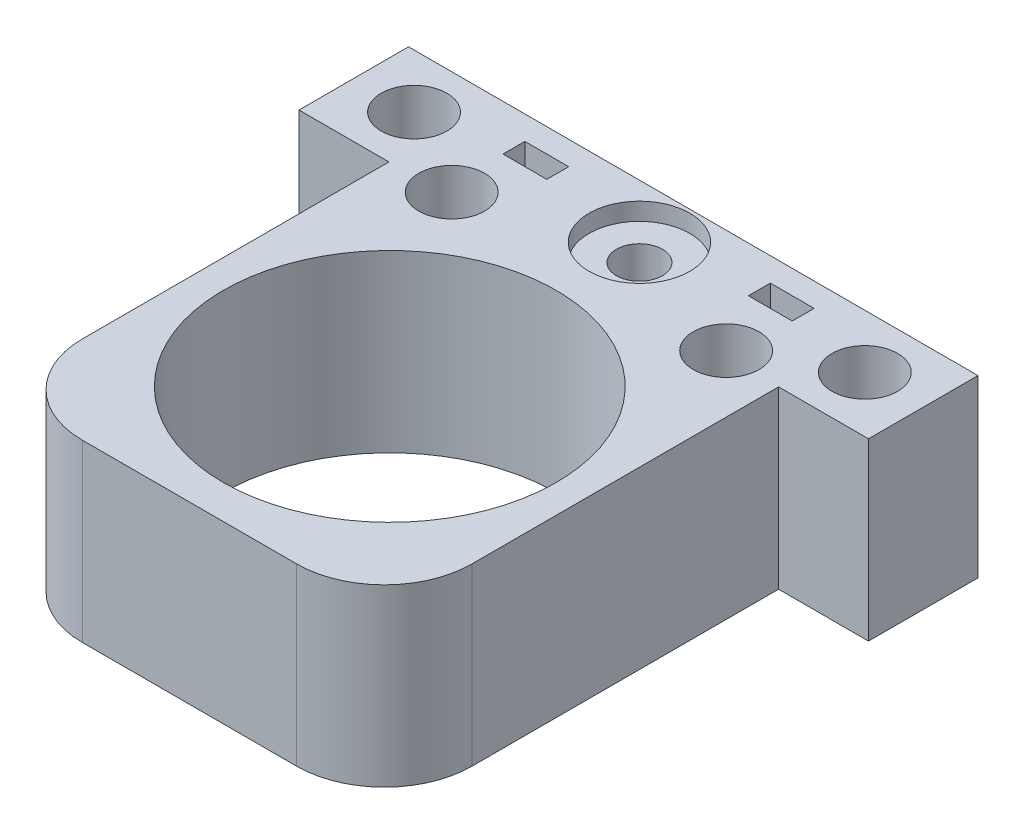
ISO-10303-21;
HEADER;
FILE_DESCRIPTION(('STEP AP214'),'2;1');
FILE_NAME('part.step','',(''),(''),'','','');
FILE_SCHEMA(('AUTOMOTIVE_DESIGN { 1 0 10303 214 1 1 1 1 }'));
ENDSEC;
DATA;
#1=APPLICATION_CONTEXT('core data for automotive mechanical design processes');
#2=APPLICATION_PROTOCOL_DEFINITION('international standard','automotive_design',2000,#1);
#3=PRODUCT_CONTEXT('',#1,'mechanical');
#4=PRODUCT('Part','Part','',(#3));
#5=PRODUCT_RELATED_PRODUCT_CATEGORY('part','',(#4));
#6=PRODUCT_DEFINITION_FORMATION('','',#4);
#7=PRODUCT_DEFINITION_CONTEXT('part definition',#1,'design');
#8=PRODUCT_DEFINITION('design','',#6,#7);
#9=PRODUCT_DEFINITION_SHAPE('','',#8);
#10=(LENGTH_UNIT() NAMED_UNIT(*) SI_UNIT(.MILLI.,.METRE.));
#11=(NAMED_UNIT(*) PLANE_ANGLE_UNIT() SI_UNIT($,.RADIAN.));
#12=(NAMED_UNIT(*) SI_UNIT($,.STERADIAN.) SOLID_ANGLE_UNIT());
#13=UNCERTAINTY_MEASURE_WITH_UNIT(LENGTH_MEASURE(1.E-05),#10,'distance_accuracy_value','');
#14=(GEOMETRIC_REPRESENTATION_CONTEXT(3) GLOBAL_UNCERTAINTY_ASSIGNED_CONTEXT((#13)) GLOBAL_UNIT_ASSIGNED_CONTEXT((#10,
#11,#12)) REPRESENTATION_CONTEXT('',''));
#15=CARTESIAN_POINT('',(0.,0.,0.));
#16=DIRECTION('',(0.,0.,1.));
#17=DIRECTION('',(1.,0.,0.));
#18=AXIS2_PLACEMENT_3D('',#15,#16,#17);
#19=CARTESIAN_POINT('',(0.,0.,-12.7142223868873));
#20=DIRECTION('',(0.,1.,0.));
#21=DIRECTION('',(0.,0.,1.));
#22=AXIS2_PLACEMENT_3D('',#19,#20,#21);
#23=CYLINDRICAL_SURFACE('',#22,5.25);
#24=CARTESIAN_POINT('',(0.,56.,-12.7142223868873));
#25=DIRECTION('',(0.,1.,0.));
#26=DIRECTION('',(0.,0.,1.));
#27=AXIS2_PLACEMENT_3D('',#24,#25,#26);
#28=CIRCLE('',#27,5.25);
#29=CARTESIAN_POINT('',(0.,56.,-7.46422238688734));
#30=VERTEX_POINT('',#29);
#31=EDGE_CURVE('E315',#30,#30,#28,.F.);
#32=ORIENTED_EDGE('',*,*,#31,.F.);
#33=EDGE_LOOP('',(#32));
#34=FACE_BOUND('',#33,.T.);
#35=CARTESIAN_POINT('',(0.,20.,-12.7142223868873));
#36=DIRECTION('',(0.,-1.,0.));
#37=DIRECTION('',(0.,0.,-1.));
#38=AXIS2_PLACEMENT_3D('',#35,#36,#37);
#39=CIRCLE('',#38,5.25);
#40=CARTESIAN_POINT('',(0.,20.,-17.9642223868873));
#41=VERTEX_POINT('',#40);
#42=EDGE_CURVE('E242',#41,#41,#39,.F.);
#43=ORIENTED_EDGE('',*,*,#42,.F.);
#44=EDGE_LOOP('',(#43));
#45=FACE_BOUND('',#44,.T.);
#46=ADVANCED_FACE('F39',(#34,#45),#23,.F.);
#47=CARTESIAN_POINT('',(65.,60.,-25.));
#48=DIRECTION('',(-1.,0.,0.));
#49=DIRECTION('',(0.,0.,1.));
#50=AXIS2_PLACEMENT_3D('',#47,#48,#49);
#51=PLANE('',#50);
#52=DIRECTION('',(0.,0.,-1.));
#53=VECTOR('',#52,1.);
#54=CARTESIAN_POINT('',(65.,60.,-25.));
#55=LINE('',#54,#53);
#56=CARTESIAN_POINT('',(65.,60.,0.));
#57=VERTEX_POINT('',#56);
#58=CARTESIAN_POINT('',(65.,60.,-25.));
#59=VERTEX_POINT('',#58);
#60=EDGE_CURVE('E323',#57,#59,#55,.T.);
#61=ORIENTED_EDGE('',*,*,#60,.F.);
#62=DIRECTION('',(0.,1.,0.));
#63=VECTOR('',#62,1.);
#64=CARTESIAN_POINT('',(65.,20.,0.));
#65=LINE('',#64,#63);
#66=CARTESIAN_POINT('',(65.,20.,0.));
#67=VERTEX_POINT('',#66);
#68=EDGE_CURVE('E200',#67,#57,#65,.T.);
#69=ORIENTED_EDGE('',*,*,#68,.F.);
#70=DIRECTION('',(0.,0.,1.));
#71=VECTOR('',#70,1.);
#72=CARTESIAN_POINT('',(65.,20.,90.));
#73=LINE('',#72,#71);
#74=CARTESIAN_POINT('',(65.,20.,-25.));
#75=VERTEX_POINT('',#74);
#76=EDGE_CURVE('E197',#75,#67,#73,.T.);
#77=ORIENTED_EDGE('',*,*,#76,.F.);
#78=DIRECTION('',(0.,-1.,0.));
#79=VECTOR('',#78,1.);
#80=CARTESIAN_POINT('',(65.,60.,-25.));
#81=LINE('',#80,#79);
#82=EDGE_CURVE('E338',#59,#75,#81,.T.);
#83=ORIENTED_EDGE('',*,*,#82,.F.);
#84=EDGE_LOOP('',(#61,#69,#77,#83));
#85=FACE_BOUND('',#84,.T.);
#86=ADVANCED_FACE('F453',(#85),#51,.F.);
#87=CARTESIAN_POINT('',(-65.,60.,-25.));
#88=DIRECTION('',(0.,0.,1.));
#89=DIRECTION('',(1.,0.,0.));
#90=AXIS2_PLACEMENT_3D('',#87,#88,#89);
#91=PLANE('',#90);
#92=DIRECTION('',(1.,0.,0.));
#93=VECTOR('',#92,1.);
#94=CARTESIAN_POINT('',(-65.,20.,-25.));
#95=LINE('',#94,#93);
#96=CARTESIAN_POINT('',(-65.,20.,-25.));
#97=VERTEX_POINT('',#96);
#98=EDGE_CURVE('E194',#97,#75,#95,.T.);
#99=ORIENTED_EDGE('',*,*,#98,.F.);
#100=DIRECTION('',(0.,-1.,0.));
#101=VECTOR('',#100,1.);
#102=CARTESIAN_POINT('',(-65.,60.,-25.));
#103=LINE('',#102,#101);
#104=CARTESIAN_POINT('',(-65.,60.,-25.));
#105=VERTEX_POINT('',#104);
#106=EDGE_CURVE('E192',#105,#97,#103,.T.);
#107=ORIENTED_EDGE('',*,*,#106,.F.);
#108=DIRECTION('',(-1.,0.,0.));
#109=VECTOR('',#108,1.);
#110=CARTESIAN_POINT('',(-65.,60.,-25.));
#111=LINE('',#110,#109);
#112=EDGE_CURVE('E330',#59,#105,#111,.T.);
#113=ORIENTED_EDGE('',*,*,#112,.F.);
#114=ORIENTED_EDGE('',*,*,#82,.T.);
#115=EDGE_LOOP('',(#99,#107,#113,#114));
#116=FACE_BOUND('',#115,.T.);
#117=ADVANCED_FACE('F461',(#116),#91,.F.);
#118=CARTESIAN_POINT('',(-65.,60.,-25.));
#119=DIRECTION('',(1.,0.,0.));
#120=DIRECTION('',(0.,0.,-1.));
#121=AXIS2_PLACEMENT_3D('',#118,#119,#120);
#122=PLANE('',#121);
#123=DIRECTION('',(0.,0.,-1.));
#124=VECTOR('',#123,1.);
#125=CARTESIAN_POINT('',(-65.,20.,90.));
#126=LINE('',#125,#124);
#127=CARTESIAN_POINT('',(-65.,20.,0.));
#128=VERTEX_POINT('',#127);
#129=EDGE_CURVE('E180',#128,#97,#126,.T.);
#130=ORIENTED_EDGE('',*,*,#129,.F.);
#131=DIRECTION('',(0.,1.,0.));
#132=VECTOR('',#131,1.);
#133=CARTESIAN_POINT('',(-65.,20.,0.));
#134=LINE('',#133,#132);
#135=CARTESIAN_POINT('',(-65.,60.,0.));
#136=VERTEX_POINT('',#135);
#137=EDGE_CURVE('E167',#128,#136,#134,.T.);
#138=ORIENTED_EDGE('',*,*,#137,.T.);
#139=DIRECTION('',(0.,0.,1.));
#140=VECTOR('',#139,1.);
#141=CARTESIAN_POINT('',(-65.,60.,-25.));
#142=LINE('',#141,#140);
#143=EDGE_CURVE('E333',#105,#136,#142,.T.);
#144=ORIENTED_EDGE('',*,*,#143,.F.);
#145=ORIENTED_EDGE('',*,*,#106,.T.);
#146=EDGE_LOOP('',(#130,#138,#144,#145));
#147=FACE_BOUND('',#146,.T.);
#148=ADVANCED_FACE('F190',(#147),#122,.F.);
#149=CARTESIAN_POINT('',(51.4526055476511,0.,-12.7142223868873));
#150=DIRECTION('',(0.,1.,0.));
#151=DIRECTION('',(0.,0.,1.));
#152=AXIS2_PLACEMENT_3D('',#149,#150,#151);
#153=CYLINDRICAL_SURFACE('',#152,7.5);
#154=CARTESIAN_POINT('',(51.4526055476511,60.,-12.7142223868873));
#155=DIRECTION('',(0.,1.,0.));
#156=DIRECTION('',(0.,0.,-1.));
#157=AXIS2_PLACEMENT_3D('',#154,#155,#156);
#158=CIRCLE('',#157,7.5);
#159=CARTESIAN_POINT('',(51.4526055476511,60.,-20.2142223868873));
#160=VERTEX_POINT('',#159);
#161=EDGE_CURVE('E324',#160,#160,#158,.T.);
#162=ORIENTED_EDGE('',*,*,#161,.T.);
#163=EDGE_LOOP('',(#162));
#164=FACE_BOUND('',#163,.T.);
#165=CARTESIAN_POINT('',(51.4526055476511,20.,-12.7142223868873));
#166=DIRECTION('',(0.,-1.,0.));
#167=DIRECTION('',(0.,0.,-1.));
#168=AXIS2_PLACEMENT_3D('',#165,#166,#167);
#169=CIRCLE('',#168,7.5);
#170=CARTESIAN_POINT('',(51.4526055476511,20.,-20.2142223868873));
#171=VERTEX_POINT('',#170);
#172=EDGE_CURVE('E238',#171,#171,#169,.F.);
#173=ORIENTED_EDGE('',*,*,#172,.F.);
#174=EDGE_LOOP('',(#173));
#175=FACE_BOUND('',#174,.T.);
#176=ADVANCED_FACE('F474',(#164,#175),#153,.F.);
#177=CARTESIAN_POINT('',(-51.4526055476511,0.,-12.7142223868873));
#178=DIRECTION('',(0.,1.,0.));
#179=DIRECTION('',(0.,0.,1.));
#180=AXIS2_PLACEMENT_3D('',#177,#178,#179);
#181=CYLINDRICAL_SURFACE('',#180,7.5);
#182=CARTESIAN_POINT('',(-51.4526055476511,60.,-12.7142223868873));
#183=DIRECTION('',(0.,1.,0.));
#184=DIRECTION('',(0.,0.,1.));
#185=AXIS2_PLACEMENT_3D('',#182,#183,#184);
#186=CIRCLE('',#185,7.5);
#187=CARTESIAN_POINT('',(-51.4526055476511,60.,-5.21422238688734));
#188=VERTEX_POINT('',#187);
#189=EDGE_CURVE('E319',#188,#188,#186,.T.);
#190=ORIENTED_EDGE('',*,*,#189,.T.);
#191=EDGE_LOOP('',(#190));
#192=FACE_BOUND('',#191,.T.);
#193=CARTESIAN_POINT('',(-51.4526055476511,20.,-12.7142223868873));
#194=DIRECTION('',(0.,-1.,0.));
#195=DIRECTION('',(0.,0.,-1.));
#196=AXIS2_PLACEMENT_3D('',#193,#194,#195);
#197=CIRCLE('',#196,7.5);
#198=CARTESIAN_POINT('',(-51.4526055476511,20.,-20.2142223868873));
#199=VERTEX_POINT('',#198);
#200=EDGE_CURVE('E234',#199,#199,#197,.F.);
#201=ORIENTED_EDGE('',*,*,#200,.F.);
#202=EDGE_LOOP('',(#201));
#203=FACE_BOUND('',#202,.T.);
#204=ADVANCED_FACE('F470',(#192,#203),#181,.F.);
#205=CARTESIAN_POINT('',(-33.01308524261,0.,-19.5794065637342));
#206=DIRECTION('',(-1.,0.,0.));
#207=DIRECTION('',(0.,0.,1.));
#208=AXIS2_PLACEMENT_3D('',#205,#206,#207);
#209=PLANE('',#208);
#210=DIRECTION('',(0.,0.,1.));
#211=VECTOR('',#210,1.);
#212=CARTESIAN_POINT('',(-33.01308524261,20.,-19.5794065637342));
#213=LINE('',#212,#211);
#214=CARTESIAN_POINT('',(-33.01308524261,20.,-19.5794065637342));
#215=VERTEX_POINT('',#214);
#216=CARTESIAN_POINT('',(-33.01308524261,20.,-14.5794065637342));
#217=VERTEX_POINT('',#216);
#218=EDGE_CURVE('E231',#215,#217,#213,.T.);
#219=ORIENTED_EDGE('',*,*,#218,.F.);
#220=DIRECTION('',(0.,1.,0.));
#221=VECTOR('',#220,1.);
#222=CARTESIAN_POINT('',(-33.01308524261,0.,-19.5794065637342));
#223=LINE('',#222,#221);
#224=CARTESIAN_POINT('',(-33.01308524261,60.,-19.5794065637342));
#225=VERTEX_POINT('',#224);
#226=EDGE_CURVE('E299',#215,#225,#223,.T.);
#227=ORIENTED_EDGE('',*,*,#226,.T.);
#228=DIRECTION('',(0.,0.,1.));
#229=VECTOR('',#228,1.);
#230=CARTESIAN_POINT('',(-33.01308524261,60.,-19.5794065637342));
#231=LINE('',#230,#229);
#232=CARTESIAN_POINT('',(-33.01308524261,60.,-14.5794065637342));
#233=VERTEX_POINT('',#232);
#234=EDGE_CURVE('E274',#225,#233,#231,.T.);
#235=ORIENTED_EDGE('',*,*,#234,.T.);
#236=DIRECTION('',(0.,1.,0.));
#237=VECTOR('',#236,1.);
#238=CARTESIAN_POINT('',(-33.01308524261,0.,-14.5794065637342));
#239=LINE('',#238,#237);
#240=EDGE_CURVE('E298',#217,#233,#239,.T.);
#241=ORIENTED_EDGE('',*,*,#240,.F.);
#242=EDGE_LOOP('',(#219,#227,#235,#241));
#243=FACE_BOUND('',#242,.T.);
#244=ADVANCED_FACE('F473',(#243),#209,.F.);
#245=CARTESIAN_POINT('',(-33.01308524261,0.,-19.5794065637342));
#246=DIRECTION('',(0.,0.,-1.));
#247=DIRECTION('',(-1.,0.,0.));
#248=AXIS2_PLACEMENT_3D('',#245,#246,#247);
#249=PLANE('',#248);
#250=DIRECTION('',(-1.,0.,0.));
#251=VECTOR('',#250,1.);
#252=CARTESIAN_POINT('',(-33.01308524261,20.,-19.5794065637342));
#253=LINE('',#252,#251);
#254=CARTESIAN_POINT('',(-23.01308524261,20.,-19.5794065637342));
#255=VERTEX_POINT('',#254);
#256=EDGE_CURVE('E228',#255,#215,#253,.T.);
#257=ORIENTED_EDGE('',*,*,#256,.F.);
#258=DIRECTION('',(0.,1.,0.));
#259=VECTOR('',#258,1.);
#260=CARTESIAN_POINT('',(-23.01308524261,0.,-19.5794065637342));
#261=LINE('',#260,#259);
#262=CARTESIAN_POINT('',(-23.01308524261,60.,-19.5794065637342));
#263=VERTEX_POINT('',#262);
#264=EDGE_CURVE('E303',#255,#263,#261,.T.);
#265=ORIENTED_EDGE('',*,*,#264,.T.);
#266=DIRECTION('',(-1.,0.,0.));
#267=VECTOR('',#266,1.);
#268=CARTESIAN_POINT('',(-33.01308524261,60.,-19.5794065637342));
#269=LINE('',#268,#267);
#270=EDGE_CURVE('E294',#263,#225,#269,.T.);
#271=ORIENTED_EDGE('',*,*,#270,.T.);
#272=ORIENTED_EDGE('',*,*,#226,.F.);
#273=EDGE_LOOP('',(#257,#265,#271,#272));
#274=FACE_BOUND('',#273,.T.);
#275=ADVANCED_FACE('F522',(#274),#249,.F.);
#276=CARTESIAN_POINT('',(-23.01308524261,0.,-19.5794065637342));
#277=DIRECTION('',(1.,0.,0.));
#278=DIRECTION('',(0.,0.,-1.));
#279=AXIS2_PLACEMENT_3D('',#276,#277,#278);
#280=PLANE('',#279);
#281=DIRECTION('',(0.,0.,-1.));
#282=VECTOR('',#281,1.);
#283=CARTESIAN_POINT('',(-23.01308524261,20.,-19.5794065637342));
#284=LINE('',#283,#282);
#285=CARTESIAN_POINT('',(-23.01308524261,20.,-14.5794065637342));
#286=VERTEX_POINT('',#285);
#287=EDGE_CURVE('E225',#286,#255,#284,.T.);
#288=ORIENTED_EDGE('',*,*,#287,.F.);
#289=DIRECTION('',(0.,1.,0.));
#290=VECTOR('',#289,1.);
#291=CARTESIAN_POINT('',(-23.01308524261,0.,-14.5794065637342));
#292=LINE('',#291,#290);
#293=CARTESIAN_POINT('',(-23.01308524261,60.,-14.5794065637342));
#294=VERTEX_POINT('',#293);
#295=EDGE_CURVE('E306',#286,#294,#292,.T.);
#296=ORIENTED_EDGE('',*,*,#295,.T.);
#297=DIRECTION('',(0.,0.,-1.));
#298=VECTOR('',#297,1.);
#299=CARTESIAN_POINT('',(-23.01308524261,60.,-19.5794065637342));
#300=LINE('',#299,#298);
#301=EDGE_CURVE('E290',#294,#263,#300,.T.);
#302=ORIENTED_EDGE('',*,*,#301,.T.);
#303=ORIENTED_EDGE('',*,*,#264,.F.);
#304=EDGE_LOOP('',(#288,#296,#302,#303));
#305=FACE_BOUND('',#304,.T.);
#306=ADVANCED_FACE('F525',(#305),#280,.F.);
#307=CARTESIAN_POINT('',(-33.01308524261,0.,-14.5794065637342));
#308=DIRECTION('',(0.,0.,1.));
#309=DIRECTION('',(1.,0.,0.));
#310=AXIS2_PLACEMENT_3D('',#307,#308,#309);
#311=PLANE('',#310);
#312=DIRECTION('',(1.,0.,0.));
#313=VECTOR('',#312,1.);
#314=CARTESIAN_POINT('',(-33.01308524261,20.,-14.5794065637342));
#315=LINE('',#314,#313);
#316=EDGE_CURVE('E222',#217,#286,#315,.T.);
#317=ORIENTED_EDGE('',*,*,#316,.F.);
#318=ORIENTED_EDGE('',*,*,#240,.T.);
#319=DIRECTION('',(1.,0.,0.));
#320=VECTOR('',#319,1.);
#321=CARTESIAN_POINT('',(-33.01308524261,60.,-14.5794065637342));
#322=LINE('',#321,#320);
#323=EDGE_CURVE('E286',#233,#294,#322,.T.);
#324=ORIENTED_EDGE('',*,*,#323,.T.);
#325=ORIENTED_EDGE('',*,*,#295,.F.);
#326=EDGE_LOOP('',(#317,#318,#324,#325));
#327=FACE_BOUND('',#326,.T.);
#328=ADVANCED_FACE('F520',(#327),#311,.F.);
#329=CARTESIAN_POINT('',(33.01308524261,0.,-19.5794065637342));
#330=DIRECTION('',(0.,0.,-1.));
#331=DIRECTION('',(-1.,0.,0.));
#332=AXIS2_PLACEMENT_3D('',#329,#330,#331);
#333=PLANE('',#332);
#334=DIRECTION('',(-1.,0.,0.));
#335=VECTOR('',#334,1.);
#336=CARTESIAN_POINT('',(33.01308524261,20.,-19.5794065637342));
#337=LINE('',#336,#335);
#338=CARTESIAN_POINT('',(33.01308524261,20.,-19.5794065637342));
#339=VERTEX_POINT('',#338);
#340=CARTESIAN_POINT('',(23.01308524261,20.,-19.5794065637342));
#341=VERTEX_POINT('',#340);
#342=EDGE_CURVE('E219',#339,#341,#337,.T.);
#343=ORIENTED_EDGE('',*,*,#342,.F.);
#344=DIRECTION('',(0.,1.,0.));
#345=VECTOR('',#344,1.);
#346=CARTESIAN_POINT('',(33.01308524261,0.,-19.5794065637342));
#347=LINE('',#346,#345);
#348=CARTESIAN_POINT('',(33.01308524261,60.,-19.5794065637342));
#349=VERTEX_POINT('',#348);
#350=EDGE_CURVE('E271',#339,#349,#347,.T.);
#351=ORIENTED_EDGE('',*,*,#350,.T.);
#352=DIRECTION('',(-1.,0.,0.));
#353=VECTOR('',#352,1.);
#354=CARTESIAN_POINT('',(33.01308524261,60.,-19.5794065637342));
#355=LINE('',#354,#353);
#356=CARTESIAN_POINT('',(23.01308524261,60.,-19.5794065637342));
#357=VERTEX_POINT('',#356);
#358=EDGE_CURVE('E254',#349,#357,#355,.T.);
#359=ORIENTED_EDGE('',*,*,#358,.T.);
#360=DIRECTION('',(0.,1.,0.));
#361=VECTOR('',#360,1.);
#362=CARTESIAN_POINT('',(23.01308524261,0.,-19.5794065637342));
#363=LINE('',#362,#361);
#364=EDGE_CURVE('E270',#341,#357,#363,.T.);
#365=ORIENTED_EDGE('',*,*,#364,.F.);
#366=EDGE_LOOP('',(#343,#351,#359,#365));
#367=FACE_BOUND('',#366,.T.);
#368=ADVANCED_FACE('F510',(#367),#333,.F.);
#369=CARTESIAN_POINT('',(33.01308524261,0.,-19.5794065637342));
#370=DIRECTION('',(1.,0.,0.));
#371=DIRECTION('',(0.,0.,-1.));
#372=AXIS2_PLACEMENT_3D('',#369,#370,#371);
#373=PLANE('',#372);
#374=DIRECTION('',(0.,0.,-1.));
#375=VECTOR('',#374,1.);
#376=CARTESIAN_POINT('',(33.01308524261,20.,-19.5794065637342));
#377=LINE('',#376,#375);
#378=CARTESIAN_POINT('',(33.01308524261,20.,-14.5794065637342));
#379=VERTEX_POINT('',#378);
#380=EDGE_CURVE('E216',#379,#339,#377,.T.);
#381=ORIENTED_EDGE('',*,*,#380,.F.);
#382=DIRECTION('',(0.,1.,0.));
#383=VECTOR('',#382,1.);
#384=CARTESIAN_POINT('',(33.01308524261,0.,-14.5794065637342));
#385=LINE('',#384,#383);
#386=CARTESIAN_POINT('',(33.01308524261,60.,-14.5794065637342));
#387=VERTEX_POINT('',#386);
#388=EDGE_CURVE('E275',#379,#387,#385,.T.);
#389=ORIENTED_EDGE('',*,*,#388,.T.);
#390=DIRECTION('',(0.,0.,-1.));
#391=VECTOR('',#390,1.);
#392=CARTESIAN_POINT('',(33.01308524261,60.,-19.5794065637342));
#393=LINE('',#392,#391);
#394=EDGE_CURVE('E266',#387,#349,#393,.T.);
#395=ORIENTED_EDGE('',*,*,#394,.T.);
#396=ORIENTED_EDGE('',*,*,#350,.F.);
#397=EDGE_LOOP('',(#381,#389,#395,#396));
#398=FACE_BOUND('',#397,.T.);
#399=ADVANCED_FACE('F506',(#398),#373,.F.);
#400=CARTESIAN_POINT('',(33.01308524261,0.,-14.5794065637342));
#401=DIRECTION('',(0.,0.,1.));
#402=DIRECTION('',(1.,0.,0.));
#403=AXIS2_PLACEMENT_3D('',#400,#401,#402);
#404=PLANE('',#403);
#405=DIRECTION('',(1.,0.,0.));
#406=VECTOR('',#405,1.);
#407=CARTESIAN_POINT('',(33.01308524261,20.,-14.5794065637342));
#408=LINE('',#407,#406);
#409=CARTESIAN_POINT('',(23.01308524261,20.,-14.5794065637342));
#410=VERTEX_POINT('',#409);
#411=EDGE_CURVE('E213',#410,#379,#408,.T.);
#412=ORIENTED_EDGE('',*,*,#411,.F.);
#413=DIRECTION('',(0.,1.,0.));
#414=VECTOR('',#413,1.);
#415=CARTESIAN_POINT('',(23.01308524261,0.,-14.5794065637342));
#416=LINE('',#415,#414);
#417=CARTESIAN_POINT('',(23.01308524261,60.,-14.5794065637342));
#418=VERTEX_POINT('',#417);
#419=EDGE_CURVE('E278',#410,#418,#416,.T.);
#420=ORIENTED_EDGE('',*,*,#419,.T.);
#421=DIRECTION('',(1.,0.,0.));
#422=VECTOR('',#421,1.);
#423=CARTESIAN_POINT('',(33.01308524261,60.,-14.5794065637342));
#424=LINE('',#423,#422);
#425=EDGE_CURVE('E262',#418,#387,#424,.T.);
#426=ORIENTED_EDGE('',*,*,#425,.T.);
#427=ORIENTED_EDGE('',*,*,#388,.F.);
#428=EDGE_LOOP('',(#412,#420,#426,#427));
#429=FACE_BOUND('',#428,.T.);
#430=ADVANCED_FACE('F509',(#429),#404,.F.);
#431=CARTESIAN_POINT('',(23.01308524261,0.,-19.5794065637342));
#432=DIRECTION('',(-1.,0.,0.));
#433=DIRECTION('',(0.,0.,1.));
#434=AXIS2_PLACEMENT_3D('',#431,#432,#433);
#435=PLANE('',#434);
#436=DIRECTION('',(0.,0.,1.));
#437=VECTOR('',#436,1.);
#438=CARTESIAN_POINT('',(23.01308524261,20.,-19.5794065637342));
#439=LINE('',#438,#437);
#440=EDGE_CURVE('E210',#341,#410,#439,.T.);
#441=ORIENTED_EDGE('',*,*,#440,.F.);
#442=ORIENTED_EDGE('',*,*,#364,.T.);
#443=DIRECTION('',(0.,0.,1.));
#444=VECTOR('',#443,1.);
#445=CARTESIAN_POINT('',(23.01308524261,60.,-19.5794065637342));
#446=LINE('',#445,#444);
#447=EDGE_CURVE('E258',#357,#418,#446,.T.);
#448=ORIENTED_EDGE('',*,*,#447,.T.);
#449=ORIENTED_EDGE('',*,*,#419,.F.);
#450=EDGE_LOOP('',(#441,#442,#448,#449));
#451=FACE_BOUND('',#450,.T.);
#452=ADVANCED_FACE('F505',(#451),#435,.F.);
#453=CARTESIAN_POINT('',(-65.,0.,90.));
#454=DIRECTION('',(0.,0.,1.));
#455=DIRECTION('',(1.,0.,0.));
#456=AXIS2_PLACEMENT_3D('',#453,#454,#455);
#457=PLANE('',#456);
#458=DIRECTION('',(-1.,0.,0.));
#459=VECTOR('',#458,1.);
#460=CARTESIAN_POINT('',(-65.,20.,90.));
#461=LINE('',#460,#459);
#462=CARTESIAN_POINT('',(24.4743587222466,20.,90.));
#463=VERTEX_POINT('',#462);
#464=CARTESIAN_POINT('',(-24.4743587222466,20.,90.));
#465=VERTEX_POINT('',#464);
#466=EDGE_CURVE('E206',#463,#465,#461,.T.);
#467=ORIENTED_EDGE('',*,*,#466,.F.);
#468=DIRECTION('',(0.,1.,0.));
#469=VECTOR('',#468,1.);
#470=CARTESIAN_POINT('',(24.4743587222466,60.,90.));
#471=LINE('',#470,#469);
#472=CARTESIAN_POINT('',(24.4743587222466,60.,90.));
#473=VERTEX_POINT('',#472);
#474=EDGE_CURVE('E351',#463,#473,#471,.T.);
#475=ORIENTED_EDGE('',*,*,#474,.T.);
#476=DIRECTION('',(1.,0.,0.));
#477=VECTOR('',#476,1.);
#478=CARTESIAN_POINT('',(-65.,60.,90.));
#479=LINE('',#478,#477);
#480=CARTESIAN_POINT('',(-24.4743587222466,60.,90.));
#481=VERTEX_POINT('',#480);
#482=EDGE_CURVE('E250',#481,#473,#479,.T.);
#483=ORIENTED_EDGE('',*,*,#482,.F.);
#484=DIRECTION('',(0.,1.,0.));
#485=VECTOR('',#484,1.);
#486=CARTESIAN_POINT('',(-24.4743587222466,20.,90.));
#487=LINE('',#486,#485);
#488=EDGE_CURVE('E342',#481,#465,#487,.F.);
#489=ORIENTED_EDGE('',*,*,#488,.T.);
#490=EDGE_LOOP('',(#467,#475,#483,#489));
#491=FACE_BOUND('',#490,.T.);
#492=ADVANCED_FACE('F372',(#491),#457,.T.);
#493=CARTESIAN_POINT('',(0.,0.,44.2857776131127));
#494=DIRECTION('',(0.,1.,0.));
#495=DIRECTION('',(0.,0.,1.));
#496=AXIS2_PLACEMENT_3D('',#493,#494,#495);
#497=CYLINDRICAL_SURFACE('',#496,38.);
#498=CARTESIAN_POINT('',(0.,60.,44.2857776131127));
#499=DIRECTION('',(0.,1.,0.));
#500=DIRECTION('',(0.,0.,1.));
#501=AXIS2_PLACEMENT_3D('',#498,#499,#500);
#502=CIRCLE('',#501,38.);
#503=CARTESIAN_POINT('',(0.,60.,82.2857776131127));
#504=VERTEX_POINT('',#503);
#505=EDGE_CURVE('E246',#504,#504,#502,.T.);
#506=CARTESIAN_POINT('',(0.,20.,44.2857776131127));
#507=DIRECTION('',(0.,-1.,0.));
#508=DIRECTION('',(0.,0.,-1.));
#509=AXIS2_PLACEMENT_3D('',#506,#507,#508);
#510=CIRCLE('',#509,38.);
#511=CARTESIAN_POINT('',(0.,20.,82.2857776131127));
#512=VERTEX_POINT('',#511);
#513=EDGE_CURVE('E209',#512,#512,#510,.F.);
#514=CARTESIAN_POINT('',(0.,60.,82.2857776131127));
#515=CARTESIAN_POINT('',(0.,59.5833333333333,82.2857776131127));
#516=CARTESIAN_POINT('',(0.,59.1666666666667,82.2857776131127));
#517=CARTESIAN_POINT('',(0.,58.3333333333333,82.2857776131127));
#518=CARTESIAN_POINT('',(0.,57.9166666666667,82.2857776131127));
#519=CARTESIAN_POINT('',(0.,57.0833333333333,82.2857776131127));
#520=CARTESIAN_POINT('',(0.,56.6666666666667,82.2857776131127));
#521=CARTESIAN_POINT('',(0.,55.8333333333333,82.2857776131127));
#522=CARTESIAN_POINT('',(0.,55.4166666666667,82.2857776131127));
#523=CARTESIAN_POINT('',(0.,54.5833333333333,82.2857776131127));
#524=CARTESIAN_POINT('',(0.,54.1666666666667,82.2857776131127));
#525=CARTESIAN_POINT('',(0.,53.3333333333333,82.2857776131127));
#526=CARTESIAN_POINT('',(0.,52.9166666666667,82.2857776131127));
#527=CARTESIAN_POINT('',(0.,52.0833333333333,82.2857776131127));
#528=CARTESIAN_POINT('',(0.,51.6666666666667,82.2857776131127));
#529=CARTESIAN_POINT('',(0.,50.8333333333333,82.2857776131127));
#530=CARTESIAN_POINT('',(0.,50.4166666666667,82.2857776131127));
#531=CARTESIAN_POINT('',(0.,49.5833333333333,82.2857776131127));
#532=CARTESIAN_POINT('',(0.,49.1666666666667,82.2857776131127));
#533=CARTESIAN_POINT('',(0.,48.3333333333333,82.2857776131127));
#534=CARTESIAN_POINT('',(0.,47.9166666666667,82.2857776131127));
#535=CARTESIAN_POINT('',(0.,47.0833333333333,82.2857776131127));
#536=CARTESIAN_POINT('',(0.,46.6666666666667,82.2857776131127));
#537=CARTESIAN_POINT('',(0.,45.8333333333333,82.2857776131127));
#538=CARTESIAN_POINT('',(0.,45.4166666666667,82.2857776131127));
#539=CARTESIAN_POINT('',(0.,44.5833333333333,82.2857776131127));
#540=CARTESIAN_POINT('',(0.,44.1666666666667,82.2857776131127));
#541=CARTESIAN_POINT('',(0.,43.3333333333333,82.2857776131127));
#542=CARTESIAN_POINT('',(0.,42.9166666666667,82.2857776131127));
#543=CARTESIAN_POINT('',(0.,42.0833333333333,82.2857776131127));
#544=CARTESIAN_POINT('',(0.,41.6666666666667,82.2857776131127));
#545=CARTESIAN_POINT('',(0.,40.8333333333333,82.2857776131127));
#546=CARTESIAN_POINT('',(0.,40.4166666666667,82.2857776131127));
#547=CARTESIAN_POINT('',(0.,39.5833333333333,82.2857776131127));
#548=CARTESIAN_POINT('',(0.,39.1666666666667,82.2857776131127));
#549=CARTESIAN_POINT('',(0.,38.3333333333333,82.2857776131127));
#550=CARTESIAN_POINT('',(0.,37.9166666666667,82.2857776131127));
#551=CARTESIAN_POINT('',(0.,37.0833333333333,82.2857776131127));
#552=CARTESIAN_POINT('',(0.,36.6666666666667,82.2857776131127));
#553=CARTESIAN_POINT('',(0.,35.8333333333333,82.2857776131127));
#554=CARTESIAN_POINT('',(0.,35.4166666666667,82.2857776131127));
#555=CARTESIAN_POINT('',(0.,34.5833333333333,82.2857776131127));
#556=CARTESIAN_POINT('',(0.,34.1666666666667,82.2857776131127));
#557=CARTESIAN_POINT('',(0.,33.3333333333333,82.2857776131127));
#558=CARTESIAN_POINT('',(0.,32.9166666666667,82.2857776131127));
#559=CARTESIAN_POINT('',(0.,32.0833333333333,82.2857776131127));
#560=CARTESIAN_POINT('',(0.,31.6666666666667,82.2857776131127));
#561=CARTESIAN_POINT('',(0.,30.8333333333333,82.2857776131127));
#562=CARTESIAN_POINT('',(0.,30.4166666666667,82.2857776131127));
#563=CARTESIAN_POINT('',(0.,29.5833333333333,82.2857776131127));
#564=CARTESIAN_POINT('',(0.,29.1666666666667,82.2857776131127));
#565=CARTESIAN_POINT('',(0.,28.3333333333333,82.2857776131127));
#566=CARTESIAN_POINT('',(0.,27.9166666666667,82.2857776131127));
#567=CARTESIAN_POINT('',(0.,27.0833333333333,82.2857776131127));
#568=CARTESIAN_POINT('',(0.,26.6666666666667,82.2857776131127));
#569=CARTESIAN_POINT('',(0.,25.8333333333333,82.2857776131127));
#570=CARTESIAN_POINT('',(0.,25.4166666666667,82.2857776131127));
#571=CARTESIAN_POINT('',(0.,24.5833333333333,82.2857776131127));
#572=CARTESIAN_POINT('',(0.,24.1666666666667,82.2857776131127));
#573=CARTESIAN_POINT('',(0.,23.3333333333333,82.2857776131127));
#574=CARTESIAN_POINT('',(0.,22.9166666666667,82.2857776131127));
#575=CARTESIAN_POINT('',(0.,22.0833333333333,82.2857776131127));
#576=CARTESIAN_POINT('',(0.,21.6666666666667,82.2857776131127));
#577=CARTESIAN_POINT('',(0.,20.8333333333333,82.2857776131127));
#578=CARTESIAN_POINT('',(0.,20.4166666666667,82.2857776131127));
#579=CARTESIAN_POINT('',(0.,20.,82.2857776131127));
#580=B_SPLINE_CURVE_WITH_KNOTS('',3,(#514,#515,#516,#517,#518,#519,#520,#521,#522,#523,#524,
#525,#526,#527,#528,#529,#530,#531,#532,#533,#534,#535,#536,#537,#538,#539,#540,#541,#542,#543,
#544,#545,#546,#547,#548,#549,#550,#551,#552,#553,#554,#555,#556,#557,#558,#559,#560,#561,#562,
#563,#564,#565,#566,#567,#568,#569,#570,#571,#572,#573,#574,#575,#576,#577,#578,#579),
.UNSPECIFIED.,.F.,.F.,(4,2,2,2,2,2,2,2,2,2,2,2,2,2,2,2,2,2,2,2,2,2,2,2,2,2,2,2,2,2,2,2,4),(0.,
1.25,2.5,3.75,5.,6.25,7.5,8.75,10.,11.25,12.5,13.75,15.,16.25,17.5,18.75,20.,21.25,22.5,23.75,
25.,26.25,27.5,28.75,30.,31.25,32.5,33.75,35.,36.25,37.5,38.75,40.),.UNSPECIFIED.);
#581=EDGE_CURVE('BSEAM439',#504,#512,#580,.T.);
#582=ORIENTED_EDGE('',*,*,#505,.T.);
#583=ORIENTED_EDGE('',*,*,#513,.F.);
#584=ORIENTED_EDGE('',*,*,#581,.T.);
#585=ORIENTED_EDGE('',*,*,#581,.F.);
#586=EDGE_LOOP('',(#582,#584,#583,#585));
#587=FACE_BOUND('',#586,.T.);
#588=ADVANCED_FACE('F439',(#587),#497,.F.);
#589=CARTESIAN_POINT('',(0.,60.,45.));
#590=DIRECTION('',(0.,1.,0.));
#591=DIRECTION('',(0.,0.,1.));
#592=AXIS2_PLACEMENT_3D('',#589,#590,#591);
#593=PLANE('',#592);
#594=CARTESIAN_POINT('',(-31.3268293189548,60.,-1.1803993973218));
#595=DIRECTION('',(0.,1.,0.));
#596=DIRECTION('',(0.,0.,1.));
#597=AXIS2_PLACEMENT_3D('',#594,#595,#596);
#598=CIRCLE('',#597,7.5);
#599=CARTESIAN_POINT('',(-31.3268293189548,60.,6.3196006026782));
#600=VERTEX_POINT('',#599);
#601=EDGE_CURVE('E419',#600,#600,#598,.T.);
#602=ORIENTED_EDGE('',*,*,#601,.F.);
#603=EDGE_LOOP('',(#602));
#604=FACE_BOUND('',#603,.T.);
#605=CARTESIAN_POINT('',(31.3268293189548,60.,-1.18039939732181));
#606=DIRECTION('',(0.,1.,0.));
#607=DIRECTION('',(0.,0.,-1.));
#608=AXIS2_PLACEMENT_3D('',#605,#606,#607);
#609=CIRCLE('',#608,7.5);
#610=CARTESIAN_POINT('',(31.3268293189548,60.,-8.68039939732181));
#611=VERTEX_POINT('',#610);
#612=EDGE_CURVE('E411',#611,#611,#609,.T.);
#613=ORIENTED_EDGE('',*,*,#612,.F.);
#614=EDGE_LOOP('',(#613));
#615=FACE_BOUND('',#614,.T.);
#616=ORIENTED_EDGE('',*,*,#482,.T.);
#617=CARTESIAN_POINT('',(24.4743587222466,60.,70.));
#618=DIRECTION('',(0.,1.,0.));
#619=DIRECTION('',(0.,0.,1.));
#620=AXIS2_PLACEMENT_3D('',#617,#618,#619);
#621=CIRCLE('',#620,20.);
#622=CARTESIAN_POINT('',(44.4743587222466,60.,70.));
#623=VERTEX_POINT('',#622);
#624=EDGE_CURVE('E358',#473,#623,#621,.T.);
#625=ORIENTED_EDGE('',*,*,#624,.T.);
#626=DIRECTION('',(0.,0.,1.));
#627=VECTOR('',#626,1.);
#628=CARTESIAN_POINT('',(44.4743587222466,60.,0.));
#629=LINE('',#628,#627);
#630=CARTESIAN_POINT('',(44.4743587222466,60.,0.));
#631=VERTEX_POINT('',#630);
#632=EDGE_CURVE('E381',#631,#623,#629,.T.);
#633=ORIENTED_EDGE('',*,*,#632,.F.);
#634=DIRECTION('',(-1.,0.,0.));
#635=VECTOR('',#634,1.);
#636=CARTESIAN_POINT('',(65.,60.,0.));
#637=LINE('',#636,#635);
#638=EDGE_CURVE('E388',#57,#631,#637,.T.);
#639=ORIENTED_EDGE('',*,*,#638,.F.);
#640=ORIENTED_EDGE('',*,*,#60,.T.);
#641=ORIENTED_EDGE('',*,*,#112,.T.);
#642=ORIENTED_EDGE('',*,*,#143,.T.);
#643=DIRECTION('',(-1.,0.,0.));
#644=VECTOR('',#643,1.);
#645=CARTESIAN_POINT('',(-65.,60.,0.));
#646=LINE('',#645,#644);
#647=CARTESIAN_POINT('',(-44.4743587222466,60.,0.));
#648=VERTEX_POINT('',#647);
#649=EDGE_CURVE('E174',#648,#136,#646,.T.);
#650=ORIENTED_EDGE('',*,*,#649,.F.);
#651=DIRECTION('',(0.,0.,-1.));
#652=VECTOR('',#651,1.);
#653=CARTESIAN_POINT('',(-44.4743587222466,60.,0.));
#654=LINE('',#653,#652);
#655=CARTESIAN_POINT('',(-44.4743587222466,60.,70.));
#656=VERTEX_POINT('',#655);
#657=EDGE_CURVE('E397',#656,#648,#654,.T.);
#658=ORIENTED_EDGE('',*,*,#657,.F.);
#659=CARTESIAN_POINT('',(-24.4743587222466,60.,70.));
#660=DIRECTION('',(0.,1.,0.));
#661=DIRECTION('',(0.,0.,1.));
#662=AXIS2_PLACEMENT_3D('',#659,#660,#661);
#663=CIRCLE('',#662,20.);
#664=EDGE_CURVE('E355',#656,#481,#663,.T.);
#665=ORIENTED_EDGE('',*,*,#664,.T.);
#666=EDGE_LOOP('',(#616,#625,#633,#639,#640,#641,#642,#650,#658,#665));
#667=FACE_BOUND('',#666,.T.);
#668=ORIENTED_EDGE('',*,*,#505,.F.);
#669=EDGE_LOOP('',(#668));
#670=FACE_BOUND('',#669,.T.);
#671=ORIENTED_EDGE('',*,*,#358,.F.);
#672=ORIENTED_EDGE('',*,*,#394,.F.);
#673=ORIENTED_EDGE('',*,*,#425,.F.);
#674=ORIENTED_EDGE('',*,*,#447,.F.);
#675=EDGE_LOOP('',(#671,#672,#673,#674));
#676=FACE_BOUND('',#675,.T.);
#677=ORIENTED_EDGE('',*,*,#234,.F.);
#678=ORIENTED_EDGE('',*,*,#270,.F.);
#679=ORIENTED_EDGE('',*,*,#301,.F.);
#680=ORIENTED_EDGE('',*,*,#323,.F.);
#681=EDGE_LOOP('',(#677,#678,#679,#680));
#682=FACE_BOUND('',#681,.T.);
#683=CARTESIAN_POINT('',(0.,60.,-12.7142223868873));
#684=DIRECTION('',(0.,1.,0.));
#685=DIRECTION('',(0.,0.,1.));
#686=AXIS2_PLACEMENT_3D('',#683,#684,#685);
#687=CIRCLE('',#686,11.5);
#688=CARTESIAN_POINT('',(0.,60.,-1.21422238688734));
#689=VERTEX_POINT('',#688);
#690=EDGE_CURVE('E302',#689,#689,#687,.T.);
#691=ORIENTED_EDGE('',*,*,#690,.F.);
#692=EDGE_LOOP('',(#691));
#693=FACE_BOUND('',#692,.T.);
#694=ORIENTED_EDGE('',*,*,#189,.F.);
#695=EDGE_LOOP('',(#694));
#696=FACE_BOUND('',#695,.T.);
#697=ORIENTED_EDGE('',*,*,#161,.F.);
#698=EDGE_LOOP('',(#697));
#699=FACE_BOUND('',#698,.T.);
#700=ADVANCED_FACE('F378',(#604,#615,#667,#670,#676,#682,#693,#696,#699),#593,.T.);
#701=CARTESIAN_POINT('',(0.,56.,-12.7142223868873));
#702=DIRECTION('',(0.,1.,0.));
#703=DIRECTION('',(0.,0.,1.));
#704=AXIS2_PLACEMENT_3D('',#701,#702,#703);
#705=PLANE('',#704);
#706=CARTESIAN_POINT('',(0.,56.,-12.7142223868873));
#707=DIRECTION('',(0.,1.,0.));
#708=DIRECTION('',(0.,0.,1.));
#709=AXIS2_PLACEMENT_3D('',#706,#707,#708);
#710=CIRCLE('',#709,11.5);
#711=CARTESIAN_POINT('',(0.,56.,-1.21422238688734));
#712=VERTEX_POINT('',#711);
#713=EDGE_CURVE('E311',#712,#712,#710,.T.);
#714=ORIENTED_EDGE('',*,*,#713,.T.);
#715=EDGE_LOOP('',(#714));
#716=FACE_BOUND('',#715,.T.);
#717=ORIENTED_EDGE('',*,*,#31,.T.);
#718=EDGE_LOOP('',(#717));
#719=FACE_BOUND('',#718,.T.);
#720=ADVANCED_FACE('F438',(#716,#719),#705,.T.);
#721=CARTESIAN_POINT('',(0.,56.,-12.7142223868873));
#722=DIRECTION('',(0.,1.,0.));
#723=DIRECTION('',(0.,0.,1.));
#724=AXIS2_PLACEMENT_3D('',#721,#722,#723);
#725=CYLINDRICAL_SURFACE('',#724,11.5);
#726=ORIENTED_EDGE('',*,*,#713,.F.);
#727=EDGE_LOOP('',(#726));
#728=FACE_BOUND('',#727,.T.);
#729=ORIENTED_EDGE('',*,*,#690,.T.);
#730=EDGE_LOOP('',(#729));
#731=FACE_BOUND('',#730,.T.);
#732=ADVANCED_FACE('F468',(#728,#731),#725,.F.);
#733=CARTESIAN_POINT('',(0.,20.,0.));
#734=DIRECTION('',(0.,-1.,0.));
#735=DIRECTION('',(0.,0.,-1.));
#736=AXIS2_PLACEMENT_3D('',#733,#734,#735);
#737=PLANE('',#736);
#738=CARTESIAN_POINT('',(-31.3268293189548,20.,-1.1803993973218));
#739=DIRECTION('',(0.,1.,0.));
#740=DIRECTION('',(0.,0.,1.));
#741=AXIS2_PLACEMENT_3D('',#738,#739,#740);
#742=CIRCLE('',#741,7.5);
#743=CARTESIAN_POINT('',(-31.3268293189548,20.,6.3196006026782));
#744=VERTEX_POINT('',#743);
#745=EDGE_CURVE('E393',#744,#744,#742,.T.);
#746=ORIENTED_EDGE('',*,*,#745,.T.);
#747=EDGE_LOOP('',(#746));
#748=FACE_BOUND('',#747,.T.);
#749=CARTESIAN_POINT('',(31.3268293189548,20.,-1.18039939732181));
#750=DIRECTION('',(0.,1.,0.));
#751=DIRECTION('',(0.,0.,-1.));
#752=AXIS2_PLACEMENT_3D('',#749,#750,#751);
#753=CIRCLE('',#752,7.5);
#754=CARTESIAN_POINT('',(31.3268293189548,20.,-8.68039939732181));
#755=VERTEX_POINT('',#754);
#756=EDGE_CURVE('E415',#755,#755,#753,.T.);
#757=ORIENTED_EDGE('',*,*,#756,.T.);
#758=EDGE_LOOP('',(#757));
#759=FACE_BOUND('',#758,.T.);
#760=DIRECTION('',(0.,0.,1.));
#761=VECTOR('',#760,1.);
#762=CARTESIAN_POINT('',(44.4743587222466,20.,0.));
#763=LINE('',#762,#761);
#764=CARTESIAN_POINT('',(44.4743587222466,20.,0.));
#765=VERTEX_POINT('',#764);
#766=CARTESIAN_POINT('',(44.4743587222466,20.,70.));
#767=VERTEX_POINT('',#766);
#768=EDGE_CURVE('E368',#765,#767,#763,.T.);
#769=ORIENTED_EDGE('',*,*,#768,.T.);
#770=CARTESIAN_POINT('',(24.4743587222466,20.,70.));
#771=DIRECTION('',(0.,-1.,0.));
#772=DIRECTION('',(0.,0.,-1.));
#773=AXIS2_PLACEMENT_3D('',#770,#771,#772);
#774=CIRCLE('',#773,20.);
#775=EDGE_CURVE('E48',#767,#463,#774,.T.);
#776=ORIENTED_EDGE('',*,*,#775,.T.);
#777=ORIENTED_EDGE('',*,*,#466,.T.);
#778=CARTESIAN_POINT('',(-24.4743587222466,20.,70.));
#779=DIRECTION('',(0.,-1.,0.));
#780=DIRECTION('',(0.,0.,-1.));
#781=AXIS2_PLACEMENT_3D('',#778,#779,#780);
#782=CIRCLE('',#781,20.);
#783=CARTESIAN_POINT('',(-44.4743587222466,20.,70.));
#784=VERTEX_POINT('',#783);
#785=EDGE_CURVE('E55',#465,#784,#782,.T.);
#786=ORIENTED_EDGE('',*,*,#785,.T.);
#787=DIRECTION('',(0.,0.,-1.));
#788=VECTOR('',#787,1.);
#789=CARTESIAN_POINT('',(-44.4743587222466,20.,0.));
#790=LINE('',#789,#788);
#791=CARTESIAN_POINT('',(-44.4743587222466,20.,0.));
#792=VERTEX_POINT('',#791);
#793=EDGE_CURVE('E186',#784,#792,#790,.T.);
#794=ORIENTED_EDGE('',*,*,#793,.T.);
#795=DIRECTION('',(-1.,0.,0.));
#796=VECTOR('',#795,1.);
#797=CARTESIAN_POINT('',(-65.,20.,0.));
#798=LINE('',#797,#796);
#799=EDGE_CURVE('E171',#792,#128,#798,.T.);
#800=ORIENTED_EDGE('',*,*,#799,.T.);
#801=ORIENTED_EDGE('',*,*,#129,.T.);
#802=ORIENTED_EDGE('',*,*,#98,.T.);
#803=ORIENTED_EDGE('',*,*,#76,.T.);
#804=DIRECTION('',(-1.,0.,0.));
#805=VECTOR('',#804,1.);
#806=CARTESIAN_POINT('',(65.,20.,0.));
#807=LINE('',#806,#805);
#808=EDGE_CURVE('E387',#67,#765,#807,.T.);
#809=ORIENTED_EDGE('',*,*,#808,.T.);
#810=EDGE_LOOP('',(#769,#776,#777,#786,#794,#800,#801,#802,#803,#809));
#811=FACE_BOUND('',#810,.T.);
#812=ORIENTED_EDGE('',*,*,#342,.T.);
#813=ORIENTED_EDGE('',*,*,#440,.T.);
#814=ORIENTED_EDGE('',*,*,#411,.T.);
#815=ORIENTED_EDGE('',*,*,#380,.T.);
#816=EDGE_LOOP('',(#812,#813,#814,#815));
#817=FACE_BOUND('',#816,.T.);
#818=ORIENTED_EDGE('',*,*,#513,.T.);
#819=EDGE_LOOP('',(#818));
#820=FACE_BOUND('',#819,.T.);
#821=ORIENTED_EDGE('',*,*,#218,.T.);
#822=ORIENTED_EDGE('',*,*,#316,.T.);
#823=ORIENTED_EDGE('',*,*,#287,.T.);
#824=ORIENTED_EDGE('',*,*,#256,.T.);
#825=EDGE_LOOP('',(#821,#822,#823,#824));
#826=FACE_BOUND('',#825,.T.);
#827=ORIENTED_EDGE('',*,*,#200,.T.);
#828=EDGE_LOOP('',(#827));
#829=FACE_BOUND('',#828,.T.);
#830=ORIENTED_EDGE('',*,*,#172,.T.);
#831=EDGE_LOOP('',(#830));
#832=FACE_BOUND('',#831,.T.);
#833=ORIENTED_EDGE('',*,*,#42,.T.);
#834=EDGE_LOOP('',(#833));
#835=FACE_BOUND('',#834,.T.);
#836=ADVANCED_FACE('F183',(#748,#759,#811,#817,#820,#826,#829,#832,#835),#737,.T.);
#837=CARTESIAN_POINT('',(44.4743587222466,20.,0.));
#838=DIRECTION('',(-1.,0.,0.));
#839=DIRECTION('',(0.,0.,1.));
#840=AXIS2_PLACEMENT_3D('',#837,#838,#839);
#841=PLANE('',#840);
#842=ORIENTED_EDGE('',*,*,#632,.T.);
#843=DIRECTION('',(0.,1.,0.));
#844=VECTOR('',#843,1.);
#845=CARTESIAN_POINT('',(44.4743587222466,20.,70.));
#846=LINE('',#845,#844);
#847=EDGE_CURVE('E63',#623,#767,#846,.F.);
#848=ORIENTED_EDGE('',*,*,#847,.T.);
#849=ORIENTED_EDGE('',*,*,#768,.F.);
#850=DIRECTION('',(0.,1.,0.));
#851=VECTOR('',#850,1.);
#852=CARTESIAN_POINT('',(44.4743587222466,20.,0.));
#853=LINE('',#852,#851);
#854=EDGE_CURVE('E384',#765,#631,#853,.T.);
#855=ORIENTED_EDGE('',*,*,#854,.T.);
#856=EDGE_LOOP('',(#842,#848,#849,#855));
#857=FACE_BOUND('',#856,.T.);
#858=ADVANCED_FACE('F382',(#857),#841,.F.);
#859=CARTESIAN_POINT('',(65.,20.,0.));
#860=DIRECTION('',(0.,0.,-1.));
#861=DIRECTION('',(-1.,0.,0.));
#862=AXIS2_PLACEMENT_3D('',#859,#860,#861);
#863=PLANE('',#862);
#864=ORIENTED_EDGE('',*,*,#638,.T.);
#865=ORIENTED_EDGE('',*,*,#854,.F.);
#866=ORIENTED_EDGE('',*,*,#808,.F.);
#867=ORIENTED_EDGE('',*,*,#68,.T.);
#868=EDGE_LOOP('',(#864,#865,#866,#867));
#869=FACE_BOUND('',#868,.T.);
#870=ADVANCED_FACE('F492',(#869),#863,.F.);
#871=CARTESIAN_POINT('',(-65.,20.,0.));
#872=DIRECTION('',(0.,0.,-1.));
#873=DIRECTION('',(-1.,0.,0.));
#874=AXIS2_PLACEMENT_3D('',#871,#872,#873);
#875=PLANE('',#874);
#876=ORIENTED_EDGE('',*,*,#649,.T.);
#877=ORIENTED_EDGE('',*,*,#137,.F.);
#878=ORIENTED_EDGE('',*,*,#799,.F.);
#879=DIRECTION('',(0.,1.,0.));
#880=VECTOR('',#879,1.);
#881=CARTESIAN_POINT('',(-44.4743587222466,20.,0.));
#882=LINE('',#881,#880);
#883=EDGE_CURVE('E181',#792,#648,#882,.T.);
#884=ORIENTED_EDGE('',*,*,#883,.T.);
#885=EDGE_LOOP('',(#876,#877,#878,#884));
#886=FACE_BOUND('',#885,.T.);
#887=ADVANCED_FACE('F169',(#886),#875,.F.);
#888=CARTESIAN_POINT('',(-44.4743587222466,20.,0.));
#889=DIRECTION('',(1.,0.,0.));
#890=DIRECTION('',(0.,0.,-1.));
#891=AXIS2_PLACEMENT_3D('',#888,#889,#890);
#892=PLANE('',#891);
#893=ORIENTED_EDGE('',*,*,#793,.F.);
#894=DIRECTION('',(0.,1.,0.));
#895=VECTOR('',#894,1.);
#896=CARTESIAN_POINT('',(-44.4743587222466,60.,70.));
#897=LINE('',#896,#895);
#898=EDGE_CURVE('E11',#784,#656,#897,.T.);
#899=ORIENTED_EDGE('',*,*,#898,.T.);
#900=ORIENTED_EDGE('',*,*,#657,.T.);
#901=ORIENTED_EDGE('',*,*,#883,.F.);
#902=EDGE_LOOP('',(#893,#899,#900,#901));
#903=FACE_BOUND('',#902,.T.);
#904=ADVANCED_FACE('F483',(#903),#892,.F.);
#905=CARTESIAN_POINT('',(24.4743587222466,0.,70.));
#906=DIRECTION('',(0.,-1.,0.));
#907=DIRECTION('',(0.,0.,-1.));
#908=AXIS2_PLACEMENT_3D('',#905,#906,#907);
#909=CYLINDRICAL_SURFACE('',#908,20.);
#910=ORIENTED_EDGE('',*,*,#775,.F.);
#911=ORIENTED_EDGE('',*,*,#847,.F.);
#912=ORIENTED_EDGE('',*,*,#624,.F.);
#913=ORIENTED_EDGE('',*,*,#474,.F.);
#914=EDGE_LOOP('',(#910,#911,#912,#913));
#915=FACE_BOUND('',#914,.T.);
#916=ADVANCED_FACE('F375',(#915),#909,.T.);
#917=CARTESIAN_POINT('',(-24.4743587222466,20.,70.));
#918=DIRECTION('',(0.,-1.,0.));
#919=DIRECTION('',(0.,0.,-1.));
#920=AXIS2_PLACEMENT_3D('',#917,#918,#919);
#921=CYLINDRICAL_SURFACE('',#920,20.);
#922=ORIENTED_EDGE('',*,*,#785,.F.);
#923=ORIENTED_EDGE('',*,*,#488,.F.);
#924=ORIENTED_EDGE('',*,*,#664,.F.);
#925=ORIENTED_EDGE('',*,*,#898,.F.);
#926=EDGE_LOOP('',(#922,#923,#924,#925));
#927=FACE_BOUND('',#926,.T.);
#928=ADVANCED_FACE('F41',(#927),#921,.T.);
#929=CARTESIAN_POINT('',(31.3268293189548,20.,-1.18039939732181));
#930=DIRECTION('',(0.,1.,0.));
#931=DIRECTION('',(0.,0.,1.));
#932=AXIS2_PLACEMENT_3D('',#929,#930,#931);
#933=CYLINDRICAL_SURFACE('',#932,7.5);
#934=ORIENTED_EDGE('',*,*,#756,.F.);
#935=EDGE_LOOP('',(#934));
#936=FACE_BOUND('',#935,.T.);
#937=ORIENTED_EDGE('',*,*,#612,.T.);
#938=EDGE_LOOP('',(#937));
#939=FACE_BOUND('',#938,.T.);
#940=ADVANCED_FACE('F432',(#936,#939),#933,.F.);
#941=CARTESIAN_POINT('',(-31.3268293189548,20.,-1.1803993973218));
#942=DIRECTION('',(0.,1.,0.));
#943=DIRECTION('',(0.,0.,1.));
#944=AXIS2_PLACEMENT_3D('',#941,#942,#943);
#945=CYLINDRICAL_SURFACE('',#944,7.5);
#946=ORIENTED_EDGE('',*,*,#745,.F.);
#947=EDGE_LOOP('',(#946));
#948=FACE_BOUND('',#947,.T.);
#949=ORIENTED_EDGE('',*,*,#601,.T.);
#950=EDGE_LOOP('',(#949));
#951=FACE_BOUND('',#950,.T.);
#952=ADVANCED_FACE('F429',(#948,#951),#945,.F.);
#953=CLOSED_SHELL('',(#46,#86,#117,#148,#176,#204,#244,#275,#306,#328,#368,#399,#430,#452,#492,
#588,#700,#720,#732,#836,#858,#870,#887,#904,#916,#928,#940,#952));
#954=MANIFOLD_SOLID_BREP('B2',#953);
#955=ADVANCED_BREP_SHAPE_REPRESENTATION('',(#18,#954),#14);
#956=SHAPE_DEFINITION_REPRESENTATION(#9,#955);
ENDSEC;
END-ISO-10303-21;
